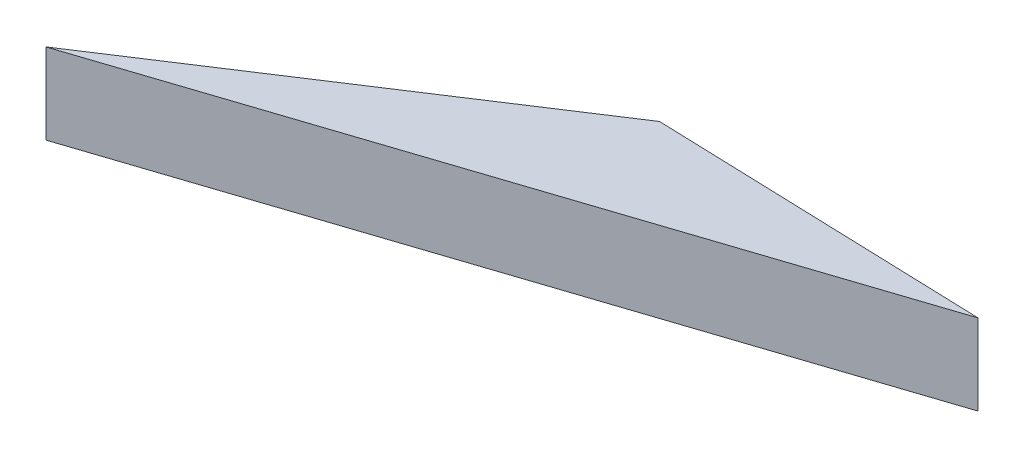
ISO-10303-21;
HEADER;
FILE_DESCRIPTION(('STEP AP214'),'2;1');
FILE_NAME('part.step','',(''),(''),'','','');
FILE_SCHEMA(('AUTOMOTIVE_DESIGN { 1 0 10303 214 1 1 1 1 }'));
ENDSEC;
DATA;
#1=APPLICATION_CONTEXT('core data for automotive mechanical design processes');
#2=APPLICATION_PROTOCOL_DEFINITION('international standard','automotive_design',2000,#1);
#3=PRODUCT_CONTEXT('',#1,'mechanical');
#4=PRODUCT('Part','Part','',(#3));
#5=PRODUCT_RELATED_PRODUCT_CATEGORY('part','',(#4));
#6=PRODUCT_DEFINITION_FORMATION('','',#4);
#7=PRODUCT_DEFINITION_CONTEXT('part definition',#1,'design');
#8=PRODUCT_DEFINITION('design','',#6,#7);
#9=PRODUCT_DEFINITION_SHAPE('','',#8);
#10=(LENGTH_UNIT() NAMED_UNIT(*) SI_UNIT(.MILLI.,.METRE.));
#11=(NAMED_UNIT(*) PLANE_ANGLE_UNIT() SI_UNIT($,.RADIAN.));
#12=(NAMED_UNIT(*) SI_UNIT($,.STERADIAN.) SOLID_ANGLE_UNIT());
#13=UNCERTAINTY_MEASURE_WITH_UNIT(LENGTH_MEASURE(1.E-05),#10,'distance_accuracy_value','');
#14=(GEOMETRIC_REPRESENTATION_CONTEXT(3) GLOBAL_UNCERTAINTY_ASSIGNED_CONTEXT((#13)) GLOBAL_UNIT_ASSIGNED_CONTEXT((#10,
#11,#12)) REPRESENTATION_CONTEXT('',''));
#15=CARTESIAN_POINT('',(0.,0.,0.));
#16=DIRECTION('',(0.,0.,1.));
#17=DIRECTION('',(1.,0.,0.));
#18=AXIS2_PLACEMENT_3D('',#15,#16,#17);
#19=CARTESIAN_POINT('',(0.,0.,0.));
#20=DIRECTION('',(0.,-1.,0.));
#21=DIRECTION('',(0.,0.,-1.));
#22=AXIS2_PLACEMENT_3D('',#19,#20,#21);
#23=PLANE('',#22);
#24=DIRECTION('',(-0.837610596838614,0.,0.546267780546922));
#25=VECTOR('',#24,1.);
#26=CARTESIAN_POINT('',(0.,0.,0.));
#27=LINE('',#26,#25);
#28=CARTESIAN_POINT('',(230.,0.,-150.));
#29=VERTEX_POINT('',#28);
#30=CARTESIAN_POINT('',(0.,0.,0.));
#31=VERTEX_POINT('',#30);
#32=EDGE_CURVE('E83',#29,#31,#27,.T.);
#33=ORIENTED_EDGE('',*,*,#32,.F.);
#34=DIRECTION('',(-0.999456759577972,0.,-0.0329573320203445));
#35=VECTOR('',#34,1.);
#36=CARTESIAN_POINT('',(230.,0.,-150.));
#37=LINE('',#36,#35);
#38=CARTESIAN_POINT('',(433.953035653861,0.,-143.274598577491));
#39=VERTEX_POINT('',#38);
#40=EDGE_CURVE('E88',#39,#29,#37,.T.);
#41=ORIENTED_EDGE('',*,*,#40,.F.);
#42=DIRECTION('',(0.949582992262143,0.,-0.313515774414105));
#43=VECTOR('',#42,1.);
#44=CARTESIAN_POINT('',(433.953035653861,0.,-143.274598577491));
#45=LINE('',#44,#43);
#46=EDGE_CURVE('E56',#31,#39,#45,.T.);
#47=ORIENTED_EDGE('',*,*,#46,.F.);
#48=EDGE_LOOP('',(#33,#41,#47));
#49=FACE_BOUND('',#48,.T.);
#50=ADVANCED_FACE('F43',(#49),#23,.T.);
#51=CARTESIAN_POINT('',(433.953035653861,0.,-143.274598577491));
#52=DIRECTION('',(0.313515774414105,0.,0.949582992262142));
#53=DIRECTION('',(0.949582992262143,0.,-0.313515774414105));
#54=AXIS2_PLACEMENT_3D('',#51,#52,#53);
#55=PLANE('',#54);
#56=DIRECTION('',(0.949582992262143,0.,-0.313515774414105));
#57=VECTOR('',#56,1.);
#58=CARTESIAN_POINT('',(433.953035653861,50.,-143.274598577491));
#59=LINE('',#58,#57);
#60=CARTESIAN_POINT('',(0.,50.,0.));
#61=VERTEX_POINT('',#60);
#62=CARTESIAN_POINT('',(433.953035653861,50.,-143.274598577491));
#63=VERTEX_POINT('',#62);
#64=EDGE_CURVE('E78',#61,#63,#59,.T.);
#65=ORIENTED_EDGE('',*,*,#64,.F.);
#66=DIRECTION('',(0.,1.,0.));
#67=VECTOR('',#66,1.);
#68=CARTESIAN_POINT('',(0.,0.,0.));
#69=LINE('',#68,#67);
#70=EDGE_CURVE('E12',#31,#61,#69,.T.);
#71=ORIENTED_EDGE('',*,*,#70,.F.);
#72=ORIENTED_EDGE('',*,*,#46,.T.);
#73=DIRECTION('',(0.,1.,0.));
#74=VECTOR('',#73,1.);
#75=CARTESIAN_POINT('',(433.953035653861,0.,-143.274598577491));
#76=LINE('',#75,#74);
#77=EDGE_CURVE('E46',#39,#63,#76,.T.);
#78=ORIENTED_EDGE('',*,*,#77,.T.);
#79=EDGE_LOOP('',(#65,#71,#72,#78));
#80=FACE_BOUND('',#79,.T.);
#81=ADVANCED_FACE('F80',(#80),#55,.T.);
#82=CARTESIAN_POINT('',(0.,0.,0.));
#83=DIRECTION('',(-0.546267780546922,0.,-0.837610596838614));
#84=DIRECTION('',(-0.837610596838614,0.,0.546267780546922));
#85=AXIS2_PLACEMENT_3D('',#82,#83,#84);
#86=PLANE('',#85);
#87=DIRECTION('',(-0.837610596838614,0.,0.546267780546922));
#88=VECTOR('',#87,1.);
#89=CARTESIAN_POINT('',(0.,50.,0.));
#90=LINE('',#89,#88);
#91=CARTESIAN_POINT('',(230.,50.,-150.));
#92=VERTEX_POINT('',#91);
#93=EDGE_CURVE('E68',#92,#61,#90,.T.);
#94=ORIENTED_EDGE('',*,*,#93,.F.);
#95=DIRECTION('',(0.,1.,0.));
#96=VECTOR('',#95,1.);
#97=CARTESIAN_POINT('',(230.,0.,-150.));
#98=LINE('',#97,#96);
#99=EDGE_CURVE('E51',#29,#92,#98,.T.);
#100=ORIENTED_EDGE('',*,*,#99,.F.);
#101=ORIENTED_EDGE('',*,*,#32,.T.);
#102=ORIENTED_EDGE('',*,*,#70,.T.);
#103=EDGE_LOOP('',(#94,#100,#101,#102));
#104=FACE_BOUND('',#103,.T.);
#105=ADVANCED_FACE('F85',(#104),#86,.T.);
#106=CARTESIAN_POINT('',(230.,0.,-150.));
#107=DIRECTION('',(0.0329573320203445,0.,-0.999456759577972));
#108=DIRECTION('',(-0.999456759577972,0.,-0.0329573320203445));
#109=AXIS2_PLACEMENT_3D('',#106,#107,#108);
#110=PLANE('',#109);
#111=DIRECTION('',(-0.999456759577972,0.,-0.0329573320203445));
#112=VECTOR('',#111,1.);
#113=CARTESIAN_POINT('',(230.,50.,-150.));
#114=LINE('',#113,#112);
#115=EDGE_CURVE('E89',#63,#92,#114,.T.);
#116=ORIENTED_EDGE('',*,*,#115,.F.);
#117=ORIENTED_EDGE('',*,*,#77,.F.);
#118=ORIENTED_EDGE('',*,*,#40,.T.);
#119=ORIENTED_EDGE('',*,*,#99,.T.);
#120=EDGE_LOOP('',(#116,#117,#118,#119));
#121=FACE_BOUND('',#120,.T.);
#122=ADVANCED_FACE('F100',(#121),#110,.T.);
#123=CARTESIAN_POINT('',(0.,50.,0.));
#124=DIRECTION('',(0.,-1.,0.));
#125=DIRECTION('',(0.,0.,-1.));
#126=AXIS2_PLACEMENT_3D('',#123,#124,#125);
#127=PLANE('',#126);
#128=ORIENTED_EDGE('',*,*,#93,.T.);
#129=ORIENTED_EDGE('',*,*,#64,.T.);
#130=ORIENTED_EDGE('',*,*,#115,.T.);
#131=EDGE_LOOP('',(#128,#129,#130));
#132=FACE_BOUND('',#131,.T.);
#133=ADVANCED_FACE('F97',(#132),#127,.F.);
#134=CLOSED_SHELL('',(#50,#81,#105,#122,#133));
#135=MANIFOLD_SOLID_BREP('B2',#134);
#136=ADVANCED_BREP_SHAPE_REPRESENTATION('',(#18,#135),#14);
#137=SHAPE_DEFINITION_REPRESENTATION(#9,#136);
ENDSEC;
END-ISO-10303-21;
